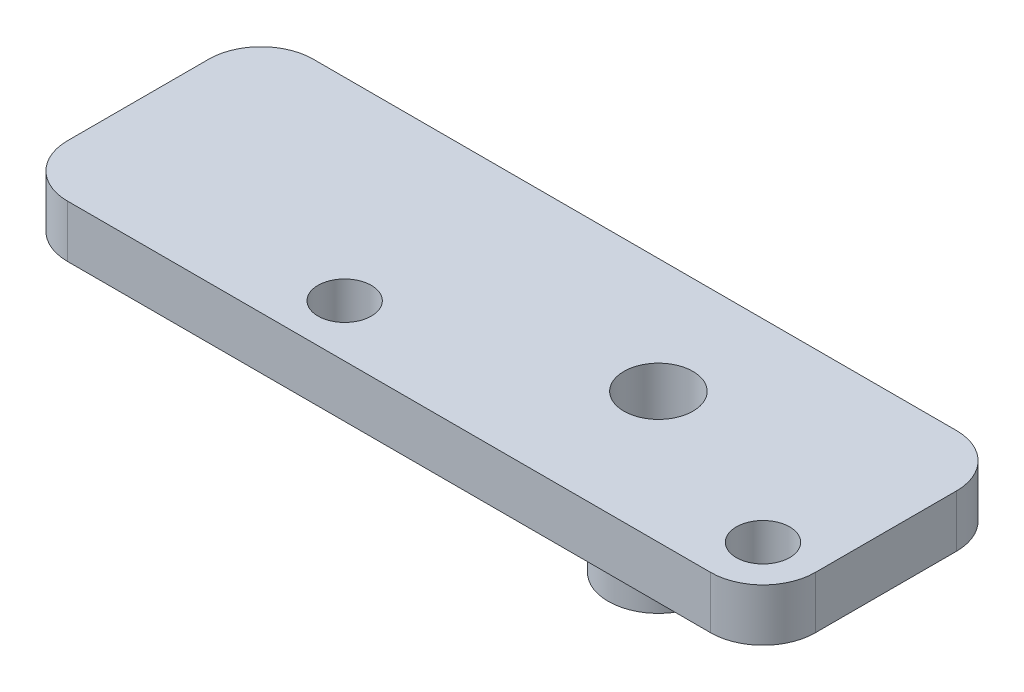
ISO-10303-21;
HEADER;
FILE_DESCRIPTION(('STEP AP214'),'2;1');
FILE_NAME('part.step','',(''),(''),'','','');
FILE_SCHEMA(('AUTOMOTIVE_DESIGN { 1 0 10303 214 1 1 1 1 }'));
ENDSEC;
DATA;
#1=APPLICATION_CONTEXT('core data for automotive mechanical design processes');
#2=APPLICATION_PROTOCOL_DEFINITION('international standard','automotive_design',2000,#1);
#3=PRODUCT_CONTEXT('',#1,'mechanical');
#4=PRODUCT('Part','Part','',(#3));
#5=PRODUCT_RELATED_PRODUCT_CATEGORY('part','',(#4));
#6=PRODUCT_DEFINITION_FORMATION('','',#4);
#7=PRODUCT_DEFINITION_CONTEXT('part definition',#1,'design');
#8=PRODUCT_DEFINITION('design','',#6,#7);
#9=PRODUCT_DEFINITION_SHAPE('','',#8);
#10=(LENGTH_UNIT() NAMED_UNIT(*) SI_UNIT(.MILLI.,.METRE.));
#11=(NAMED_UNIT(*) PLANE_ANGLE_UNIT() SI_UNIT($,.RADIAN.));
#12=(NAMED_UNIT(*) SI_UNIT($,.STERADIAN.) SOLID_ANGLE_UNIT());
#13=UNCERTAINTY_MEASURE_WITH_UNIT(LENGTH_MEASURE(1.E-05),#10,'distance_accuracy_value','');
#14=(GEOMETRIC_REPRESENTATION_CONTEXT(3) GLOBAL_UNCERTAINTY_ASSIGNED_CONTEXT((#13)) GLOBAL_UNIT_ASSIGNED_CONTEXT((#10,
#11,#12)) REPRESENTATION_CONTEXT('',''));
#15=CARTESIAN_POINT('',(0.,0.,0.));
#16=DIRECTION('',(0.,0.,1.));
#17=DIRECTION('',(1.,0.,0.));
#18=AXIS2_PLACEMENT_3D('',#15,#16,#17);
#19=CARTESIAN_POINT('',(0.,0.,0.));
#20=DIRECTION('',(0.,1.,0.));
#21=DIRECTION('',(0.,0.,1.));
#22=AXIS2_PLACEMENT_3D('',#19,#20,#21);
#23=PLANE('',#22);
#24=CARTESIAN_POINT('',(35.,0.,15.));
#25=DIRECTION('',(0.,1.,0.));
#26=DIRECTION('',(0.,0.,1.));
#27=AXIS2_PLACEMENT_3D('',#24,#25,#26);
#28=CIRCLE('',#27,5.1);
#29=CARTESIAN_POINT('',(35.,0.,20.1));
#30=VERTEX_POINT('',#29);
#31=EDGE_CURVE('E235',#30,#30,#28,.T.);
#32=ORIENTED_EDGE('',*,*,#31,.T.);
#33=EDGE_LOOP('',(#32));
#34=FACE_BOUND('',#33,.T.);
#35=DIRECTION('',(-1.,0.,0.));
#36=VECTOR('',#35,1.);
#37=CARTESIAN_POINT('',(45.,0.,-22.));
#38=LINE('',#37,#36);
#39=CARTESIAN_POINT('',(35.,0.,-22.));
#40=VERTEX_POINT('',#39);
#41=CARTESIAN_POINT('',(-88.,0.,-22.));
#42=VERTEX_POINT('',#41);
#43=EDGE_CURVE('E98',#40,#42,#38,.T.);
#44=ORIENTED_EDGE('',*,*,#43,.F.);
#45=CARTESIAN_POINT('',(35.,0.,-12.));
#46=DIRECTION('',(0.,1.,0.));
#47=DIRECTION('',(0.,0.,1.));
#48=AXIS2_PLACEMENT_3D('',#45,#46,#47);
#49=CIRCLE('',#48,10.);
#50=CARTESIAN_POINT('',(45.,0.,-12.));
#51=VERTEX_POINT('',#50);
#52=EDGE_CURVE('E41',#40,#51,#49,.F.);
#53=ORIENTED_EDGE('',*,*,#52,.T.);
#54=DIRECTION('',(0.,0.,-1.));
#55=VECTOR('',#54,1.);
#56=CARTESIAN_POINT('',(45.,0.,25.));
#57=LINE('',#56,#55);
#58=CARTESIAN_POINT('',(45.,0.,15.));
#59=VERTEX_POINT('',#58);
#60=EDGE_CURVE('E106',#59,#51,#57,.T.);
#61=ORIENTED_EDGE('',*,*,#60,.F.);
#62=CARTESIAN_POINT('',(35.,0.,15.));
#63=DIRECTION('',(0.,1.,0.));
#64=DIRECTION('',(0.,0.,1.));
#65=AXIS2_PLACEMENT_3D('',#62,#63,#64);
#66=CIRCLE('',#65,10.);
#67=CARTESIAN_POINT('',(35.,0.,25.));
#68=VERTEX_POINT('',#67);
#69=EDGE_CURVE('E147',#59,#68,#66,.F.);
#70=ORIENTED_EDGE('',*,*,#69,.T.);
#71=DIRECTION('',(1.,0.,0.));
#72=VECTOR('',#71,1.);
#73=CARTESIAN_POINT('',(45.,0.,25.));
#74=LINE('',#73,#72);
#75=CARTESIAN_POINT('',(-88.,0.,25.));
#76=VERTEX_POINT('',#75);
#77=EDGE_CURVE('E127',#76,#68,#74,.T.);
#78=ORIENTED_EDGE('',*,*,#77,.F.);
#79=CARTESIAN_POINT('',(-88.,0.,15.));
#80=DIRECTION('',(0.,1.,0.));
#81=DIRECTION('',(0.,0.,1.));
#82=AXIS2_PLACEMENT_3D('',#79,#80,#81);
#83=CIRCLE('',#82,10.);
#84=CARTESIAN_POINT('',(-98.,0.,15.));
#85=VERTEX_POINT('',#84);
#86=EDGE_CURVE('E137',#76,#85,#83,.F.);
#87=ORIENTED_EDGE('',*,*,#86,.T.);
#88=DIRECTION('',(0.,0.,1.));
#89=VECTOR('',#88,1.);
#90=CARTESIAN_POINT('',(-98.,0.,25.));
#91=LINE('',#90,#89);
#92=CARTESIAN_POINT('',(-98.,0.,-12.));
#93=VERTEX_POINT('',#92);
#94=EDGE_CURVE('E105',#93,#85,#91,.T.);
#95=ORIENTED_EDGE('',*,*,#94,.F.);
#96=CARTESIAN_POINT('',(-88.,0.,-12.));
#97=DIRECTION('',(0.,1.,0.));
#98=DIRECTION('',(0.,0.,1.));
#99=AXIS2_PLACEMENT_3D('',#96,#97,#98);
#100=CIRCLE('',#99,10.);
#101=EDGE_CURVE('E109',#93,#42,#100,.F.);
#102=ORIENTED_EDGE('',*,*,#101,.T.);
#103=EDGE_LOOP('',(#44,#53,#61,#70,#78,#87,#95,#102));
#104=FACE_BOUND('',#103,.T.);
#105=CARTESIAN_POINT('',(-45.,0.,15.));
#106=DIRECTION('',(0.,1.,0.));
#107=DIRECTION('',(0.,0.,1.));
#108=AXIS2_PLACEMENT_3D('',#105,#106,#107);
#109=CIRCLE('',#108,5.1);
#110=CARTESIAN_POINT('',(-45.,0.,20.1));
#111=VERTEX_POINT('',#110);
#112=EDGE_CURVE('E241',#111,#111,#109,.T.);
#113=ORIENTED_EDGE('',*,*,#112,.T.);
#114=EDGE_LOOP('',(#113));
#115=FACE_BOUND('',#114,.T.);
#116=CARTESIAN_POINT('',(0.,0.,0.));
#117=DIRECTION('',(0.,1.,0.));
#118=DIRECTION('',(0.,0.,1.));
#119=AXIS2_PLACEMENT_3D('',#116,#117,#118);
#120=CIRCLE('',#119,9.6);
#121=CARTESIAN_POINT('',(0.,0.,9.6));
#122=VERTEX_POINT('',#121);
#123=EDGE_CURVE('E11',#122,#122,#120,.F.);
#124=ORIENTED_EDGE('',*,*,#123,.F.);
#125=EDGE_LOOP('',(#124));
#126=FACE_BOUND('',#125,.T.);
#127=ADVANCED_FACE('F33',(#34,#104,#115,#126),#23,.F.);
#128=CARTESIAN_POINT('',(35.,10.,-12.));
#129=DIRECTION('',(0.,-1.,0.));
#130=DIRECTION('',(0.,0.,-1.));
#131=AXIS2_PLACEMENT_3D('',#128,#129,#130);
#132=CYLINDRICAL_SURFACE('',#131,10.);
#133=DIRECTION('',(0.,-1.,0.));
#134=VECTOR('',#133,1.);
#135=CARTESIAN_POINT('',(35.,10.,-22.));
#136=LINE('',#135,#134);
#137=CARTESIAN_POINT('',(35.,10.,-22.));
#138=VERTEX_POINT('',#137);
#139=EDGE_CURVE('E104',#138,#40,#136,.T.);
#140=ORIENTED_EDGE('',*,*,#139,.F.);
#141=CARTESIAN_POINT('',(35.,10.,-12.));
#142=DIRECTION('',(0.,1.,0.));
#143=DIRECTION('',(0.,0.,1.));
#144=AXIS2_PLACEMENT_3D('',#141,#142,#143);
#145=CIRCLE('',#144,10.);
#146=CARTESIAN_POINT('',(45.,10.,-12.));
#147=VERTEX_POINT('',#146);
#148=EDGE_CURVE('E54',#147,#138,#145,.T.);
#149=ORIENTED_EDGE('',*,*,#148,.F.);
#150=DIRECTION('',(0.,-1.,0.));
#151=VECTOR('',#150,1.);
#152=CARTESIAN_POINT('',(45.,10.,-12.));
#153=LINE('',#152,#151);
#154=EDGE_CURVE('E152',#51,#147,#153,.F.);
#155=ORIENTED_EDGE('',*,*,#154,.F.);
#156=ORIENTED_EDGE('',*,*,#52,.F.);
#157=EDGE_LOOP('',(#140,#149,#155,#156));
#158=FACE_BOUND('',#157,.T.);
#159=ADVANCED_FACE('F35',(#158),#132,.T.);
#160=CARTESIAN_POINT('',(35.,10.,15.));
#161=DIRECTION('',(0.,1.,0.));
#162=DIRECTION('',(0.,0.,1.));
#163=AXIS2_PLACEMENT_3D('',#160,#161,#162);
#164=CYLINDRICAL_SURFACE('',#163,10.);
#165=DIRECTION('',(0.,1.,0.));
#166=VECTOR('',#165,1.);
#167=CARTESIAN_POINT('',(35.,10.,25.));
#168=LINE('',#167,#166);
#169=CARTESIAN_POINT('',(35.,10.,25.));
#170=VERTEX_POINT('',#169);
#171=EDGE_CURVE('E141',#68,#170,#168,.T.);
#172=ORIENTED_EDGE('',*,*,#171,.F.);
#173=ORIENTED_EDGE('',*,*,#69,.F.);
#174=DIRECTION('',(0.,1.,0.));
#175=VECTOR('',#174,1.);
#176=CARTESIAN_POINT('',(45.,10.,15.));
#177=LINE('',#176,#175);
#178=CARTESIAN_POINT('',(45.,10.,15.));
#179=VERTEX_POINT('',#178);
#180=EDGE_CURVE('E144',#179,#59,#177,.F.);
#181=ORIENTED_EDGE('',*,*,#180,.F.);
#182=CARTESIAN_POINT('',(35.,10.,15.));
#183=DIRECTION('',(0.,1.,0.));
#184=DIRECTION('',(0.,0.,1.));
#185=AXIS2_PLACEMENT_3D('',#182,#183,#184);
#186=CIRCLE('',#185,10.);
#187=EDGE_CURVE('E149',#170,#179,#186,.T.);
#188=ORIENTED_EDGE('',*,*,#187,.F.);
#189=EDGE_LOOP('',(#172,#173,#181,#188));
#190=FACE_BOUND('',#189,.T.);
#191=ADVANCED_FACE('F180',(#190),#164,.T.);
#192=CARTESIAN_POINT('',(-88.,10.,15.));
#193=DIRECTION('',(0.,1.,0.));
#194=DIRECTION('',(0.,0.,1.));
#195=AXIS2_PLACEMENT_3D('',#192,#193,#194);
#196=CYLINDRICAL_SURFACE('',#195,10.);
#197=DIRECTION('',(0.,1.,0.));
#198=VECTOR('',#197,1.);
#199=CARTESIAN_POINT('',(-98.,10.,15.));
#200=LINE('',#199,#198);
#201=CARTESIAN_POINT('',(-98.,10.,15.));
#202=VERTEX_POINT('',#201);
#203=EDGE_CURVE('E131',#85,#202,#200,.T.);
#204=ORIENTED_EDGE('',*,*,#203,.F.);
#205=ORIENTED_EDGE('',*,*,#86,.F.);
#206=DIRECTION('',(0.,1.,0.));
#207=VECTOR('',#206,1.);
#208=CARTESIAN_POINT('',(-88.,10.,25.));
#209=LINE('',#208,#207);
#210=CARTESIAN_POINT('',(-88.,10.,25.));
#211=VERTEX_POINT('',#210);
#212=EDGE_CURVE('E134',#211,#76,#209,.F.);
#213=ORIENTED_EDGE('',*,*,#212,.F.);
#214=CARTESIAN_POINT('',(-88.,10.,15.));
#215=DIRECTION('',(0.,1.,0.));
#216=DIRECTION('',(0.,0.,1.));
#217=AXIS2_PLACEMENT_3D('',#214,#215,#216);
#218=CIRCLE('',#217,10.);
#219=EDGE_CURVE('E139',#202,#211,#218,.T.);
#220=ORIENTED_EDGE('',*,*,#219,.F.);
#221=EDGE_LOOP('',(#204,#205,#213,#220));
#222=FACE_BOUND('',#221,.T.);
#223=ADVANCED_FACE('F183',(#222),#196,.T.);
#224=CARTESIAN_POINT('',(-88.,10.,-12.));
#225=DIRECTION('',(0.,1.,0.));
#226=DIRECTION('',(0.,0.,1.));
#227=AXIS2_PLACEMENT_3D('',#224,#225,#226);
#228=CYLINDRICAL_SURFACE('',#227,10.);
#229=DIRECTION('',(0.,1.,0.));
#230=VECTOR('',#229,1.);
#231=CARTESIAN_POINT('',(-88.,10.,-22.));
#232=LINE('',#231,#230);
#233=CARTESIAN_POINT('',(-88.,10.,-22.));
#234=VERTEX_POINT('',#233);
#235=EDGE_CURVE('E103',#42,#234,#232,.T.);
#236=ORIENTED_EDGE('',*,*,#235,.F.);
#237=ORIENTED_EDGE('',*,*,#101,.F.);
#238=DIRECTION('',(0.,1.,0.));
#239=VECTOR('',#238,1.);
#240=CARTESIAN_POINT('',(-98.,10.,-12.));
#241=LINE('',#240,#239);
#242=CARTESIAN_POINT('',(-98.,10.,-12.));
#243=VERTEX_POINT('',#242);
#244=EDGE_CURVE('E116',#243,#93,#241,.F.);
#245=ORIENTED_EDGE('',*,*,#244,.F.);
#246=CARTESIAN_POINT('',(-88.,10.,-12.));
#247=DIRECTION('',(0.,1.,0.));
#248=DIRECTION('',(0.,0.,1.));
#249=AXIS2_PLACEMENT_3D('',#246,#247,#248);
#250=CIRCLE('',#249,10.);
#251=EDGE_CURVE('E115',#234,#243,#250,.T.);
#252=ORIENTED_EDGE('',*,*,#251,.F.);
#253=EDGE_LOOP('',(#236,#237,#245,#252));
#254=FACE_BOUND('',#253,.T.);
#255=ADVANCED_FACE('F119',(#254),#228,.T.);
#256=CARTESIAN_POINT('',(0.,10.,0.));
#257=DIRECTION('',(0.,1.,0.));
#258=DIRECTION('',(0.,0.,1.));
#259=AXIS2_PLACEMENT_3D('',#256,#257,#258);
#260=PLANE('',#259);
#261=CARTESIAN_POINT('',(-45.,10.,15.));
#262=DIRECTION('',(0.,1.,0.));
#263=DIRECTION('',(0.,0.,1.));
#264=AXIS2_PLACEMENT_3D('',#261,#262,#263);
#265=CIRCLE('',#264,5.1);
#266=CARTESIAN_POINT('',(-45.,10.,20.1));
#267=VERTEX_POINT('',#266);
#268=EDGE_CURVE('E243',#267,#267,#265,.T.);
#269=ORIENTED_EDGE('',*,*,#268,.F.);
#270=EDGE_LOOP('',(#269));
#271=FACE_BOUND('',#270,.T.);
#272=DIRECTION('',(0.,0.,-1.));
#273=VECTOR('',#272,1.);
#274=CARTESIAN_POINT('',(45.,10.,25.));
#275=LINE('',#274,#273);
#276=EDGE_CURVE('E160',#179,#147,#275,.T.);
#277=ORIENTED_EDGE('',*,*,#276,.T.);
#278=ORIENTED_EDGE('',*,*,#148,.T.);
#279=DIRECTION('',(-1.,0.,0.));
#280=VECTOR('',#279,1.);
#281=CARTESIAN_POINT('',(45.,10.,-22.));
#282=LINE('',#281,#280);
#283=EDGE_CURVE('E158',#138,#234,#282,.T.);
#284=ORIENTED_EDGE('',*,*,#283,.T.);
#285=ORIENTED_EDGE('',*,*,#251,.T.);
#286=DIRECTION('',(0.,0.,1.));
#287=VECTOR('',#286,1.);
#288=CARTESIAN_POINT('',(-98.,10.,25.));
#289=LINE('',#288,#287);
#290=EDGE_CURVE('E124',#243,#202,#289,.T.);
#291=ORIENTED_EDGE('',*,*,#290,.T.);
#292=ORIENTED_EDGE('',*,*,#219,.T.);
#293=DIRECTION('',(1.,0.,0.));
#294=VECTOR('',#293,1.);
#295=CARTESIAN_POINT('',(45.,10.,25.));
#296=LINE('',#295,#294);
#297=EDGE_CURVE('E120',#211,#170,#296,.T.);
#298=ORIENTED_EDGE('',*,*,#297,.T.);
#299=ORIENTED_EDGE('',*,*,#187,.T.);
#300=EDGE_LOOP('',(#277,#278,#284,#285,#291,#292,#298,#299));
#301=FACE_BOUND('',#300,.T.);
#302=CARTESIAN_POINT('',(0.,10.,0.));
#303=DIRECTION('',(0.,1.,0.));
#304=DIRECTION('',(0.,0.,1.));
#305=AXIS2_PLACEMENT_3D('',#302,#303,#304);
#306=CIRCLE('',#305,6.6);
#307=CARTESIAN_POINT('',(0.,10.,6.6));
#308=VERTEX_POINT('',#307);
#309=EDGE_CURVE('E168',#308,#308,#306,.T.);
#310=ORIENTED_EDGE('',*,*,#309,.F.);
#311=EDGE_LOOP('',(#310));
#312=FACE_BOUND('',#311,.T.);
#313=CARTESIAN_POINT('',(35.,10.,15.));
#314=DIRECTION('',(0.,1.,0.));
#315=DIRECTION('',(0.,0.,1.));
#316=AXIS2_PLACEMENT_3D('',#313,#314,#315);
#317=CIRCLE('',#316,5.1);
#318=CARTESIAN_POINT('',(35.,10.,20.1));
#319=VERTEX_POINT('',#318);
#320=EDGE_CURVE('E238',#319,#319,#317,.T.);
#321=ORIENTED_EDGE('',*,*,#320,.F.);
#322=EDGE_LOOP('',(#321));
#323=FACE_BOUND('',#322,.T.);
#324=ADVANCED_FACE('F156',(#271,#301,#312,#323),#260,.T.);
#325=CARTESIAN_POINT('',(45.,10.,25.));
#326=DIRECTION('',(-1.,0.,0.));
#327=DIRECTION('',(0.,0.,1.));
#328=AXIS2_PLACEMENT_3D('',#325,#326,#327);
#329=PLANE('',#328);
#330=ORIENTED_EDGE('',*,*,#60,.T.);
#331=ORIENTED_EDGE('',*,*,#154,.T.);
#332=ORIENTED_EDGE('',*,*,#276,.F.);
#333=ORIENTED_EDGE('',*,*,#180,.T.);
#334=EDGE_LOOP('',(#330,#331,#332,#333));
#335=FACE_BOUND('',#334,.T.);
#336=ADVANCED_FACE('F193',(#335),#329,.F.);
#337=CARTESIAN_POINT('',(45.,10.,-22.));
#338=DIRECTION('',(0.,0.,1.));
#339=DIRECTION('',(1.,0.,0.));
#340=AXIS2_PLACEMENT_3D('',#337,#338,#339);
#341=PLANE('',#340);
#342=ORIENTED_EDGE('',*,*,#283,.F.);
#343=ORIENTED_EDGE('',*,*,#139,.T.);
#344=ORIENTED_EDGE('',*,*,#43,.T.);
#345=ORIENTED_EDGE('',*,*,#235,.T.);
#346=EDGE_LOOP('',(#342,#343,#344,#345));
#347=FACE_BOUND('',#346,.T.);
#348=ADVANCED_FACE('F101',(#347),#341,.F.);
#349=CARTESIAN_POINT('',(-98.,10.,25.));
#350=DIRECTION('',(1.,0.,0.));
#351=DIRECTION('',(0.,0.,-1.));
#352=AXIS2_PLACEMENT_3D('',#349,#350,#351);
#353=PLANE('',#352);
#354=ORIENTED_EDGE('',*,*,#94,.T.);
#355=ORIENTED_EDGE('',*,*,#203,.T.);
#356=ORIENTED_EDGE('',*,*,#290,.F.);
#357=ORIENTED_EDGE('',*,*,#244,.T.);
#358=EDGE_LOOP('',(#354,#355,#356,#357));
#359=FACE_BOUND('',#358,.T.);
#360=ADVANCED_FACE('F184',(#359),#353,.F.);
#361=CARTESIAN_POINT('',(45.,10.,25.));
#362=DIRECTION('',(0.,0.,-1.));
#363=DIRECTION('',(-1.,0.,0.));
#364=AXIS2_PLACEMENT_3D('',#361,#362,#363);
#365=PLANE('',#364);
#366=ORIENTED_EDGE('',*,*,#77,.T.);
#367=ORIENTED_EDGE('',*,*,#171,.T.);
#368=ORIENTED_EDGE('',*,*,#297,.F.);
#369=ORIENTED_EDGE('',*,*,#212,.T.);
#370=EDGE_LOOP('',(#366,#367,#368,#369));
#371=FACE_BOUND('',#370,.T.);
#372=ADVANCED_FACE('F173',(#371),#365,.F.);
#373=CARTESIAN_POINT('',(0.,10.,0.));
#374=DIRECTION('',(0.,-1.,0.));
#375=DIRECTION('',(0.,0.,-1.));
#376=AXIS2_PLACEMENT_3D('',#373,#374,#375);
#377=CYLINDRICAL_SURFACE('',#376,6.6);
#378=ORIENTED_EDGE('',*,*,#309,.T.);
#379=EDGE_LOOP('',(#378));
#380=FACE_BOUND('',#379,.T.);
#381=CARTESIAN_POINT('',(0.,-20.,0.));
#382=DIRECTION('',(0.,-1.,0.));
#383=DIRECTION('',(0.,0.,-1.));
#384=AXIS2_PLACEMENT_3D('',#381,#382,#383);
#385=CIRCLE('',#384,6.6);
#386=CARTESIAN_POINT('',(0.,-20.,-6.6));
#387=VERTEX_POINT('',#386);
#388=EDGE_CURVE('E232',#387,#387,#385,.T.);
#389=ORIENTED_EDGE('',*,*,#388,.T.);
#390=EDGE_LOOP('',(#389));
#391=FACE_BOUND('',#390,.T.);
#392=ADVANCED_FACE('F191',(#380,#391),#377,.F.);
#393=CARTESIAN_POINT('',(-45.,10.,15.));
#394=DIRECTION('',(0.,-1.,0.));
#395=DIRECTION('',(0.,0.,-1.));
#396=AXIS2_PLACEMENT_3D('',#393,#394,#395);
#397=CYLINDRICAL_SURFACE('',#396,5.1);
#398=ORIENTED_EDGE('',*,*,#268,.T.);
#399=EDGE_LOOP('',(#398));
#400=FACE_BOUND('',#399,.T.);
#401=ORIENTED_EDGE('',*,*,#112,.F.);
#402=EDGE_LOOP('',(#401));
#403=FACE_BOUND('',#402,.T.);
#404=ADVANCED_FACE('F208',(#400,#403),#397,.F.);
#405=CARTESIAN_POINT('',(35.,10.,15.));
#406=DIRECTION('',(0.,-1.,0.));
#407=DIRECTION('',(0.,0.,-1.));
#408=AXIS2_PLACEMENT_3D('',#405,#406,#407);
#409=CYLINDRICAL_SURFACE('',#408,5.1);
#410=ORIENTED_EDGE('',*,*,#320,.T.);
#411=EDGE_LOOP('',(#410));
#412=FACE_BOUND('',#411,.T.);
#413=ORIENTED_EDGE('',*,*,#31,.F.);
#414=EDGE_LOOP('',(#413));
#415=FACE_BOUND('',#414,.T.);
#416=ADVANCED_FACE('F212',(#412,#415),#409,.F.);
#417=CARTESIAN_POINT('',(0.,-20.,0.));
#418=DIRECTION('',(0.,-1.,0.));
#419=DIRECTION('',(0.,0.,-1.));
#420=AXIS2_PLACEMENT_3D('',#417,#418,#419);
#421=PLANE('',#420);
#422=CARTESIAN_POINT('',(0.,-20.,0.));
#423=DIRECTION('',(0.,-1.,0.));
#424=DIRECTION('',(0.,0.,-1.));
#425=AXIS2_PLACEMENT_3D('',#422,#423,#424);
#426=CIRCLE('',#425,9.6);
#427=CARTESIAN_POINT('',(0.,-20.,-9.6));
#428=VERTEX_POINT('',#427);
#429=EDGE_CURVE('E229',#428,#428,#426,.T.);
#430=ORIENTED_EDGE('',*,*,#429,.T.);
#431=EDGE_LOOP('',(#430));
#432=FACE_BOUND('',#431,.T.);
#433=ORIENTED_EDGE('',*,*,#388,.F.);
#434=EDGE_LOOP('',(#433));
#435=FACE_BOUND('',#434,.T.);
#436=ADVANCED_FACE('F216',(#432,#435),#421,.T.);
#437=CARTESIAN_POINT('',(0.,-20.,0.));
#438=DIRECTION('',(0.,1.,0.));
#439=DIRECTION('',(0.,0.,1.));
#440=AXIS2_PLACEMENT_3D('',#437,#438,#439);
#441=CYLINDRICAL_SURFACE('',#440,9.6);
#442=ORIENTED_EDGE('',*,*,#429,.F.);
#443=EDGE_LOOP('',(#442));
#444=FACE_BOUND('',#443,.T.);
#445=ORIENTED_EDGE('',*,*,#123,.T.);
#446=EDGE_LOOP('',(#445));
#447=FACE_BOUND('',#446,.T.);
#448=ADVANCED_FACE('F218',(#444,#447),#441,.T.);
#449=CLOSED_SHELL('',(#127,#159,#191,#223,#255,#324,#336,#348,#360,#372,#392,#404,#416,#436,#448));
#450=MANIFOLD_SOLID_BREP('B2',#449);
#451=ADVANCED_BREP_SHAPE_REPRESENTATION('',(#18,#450),#14);
#452=SHAPE_DEFINITION_REPRESENTATION(#9,#451);
ENDSEC;
END-ISO-10303-21;
